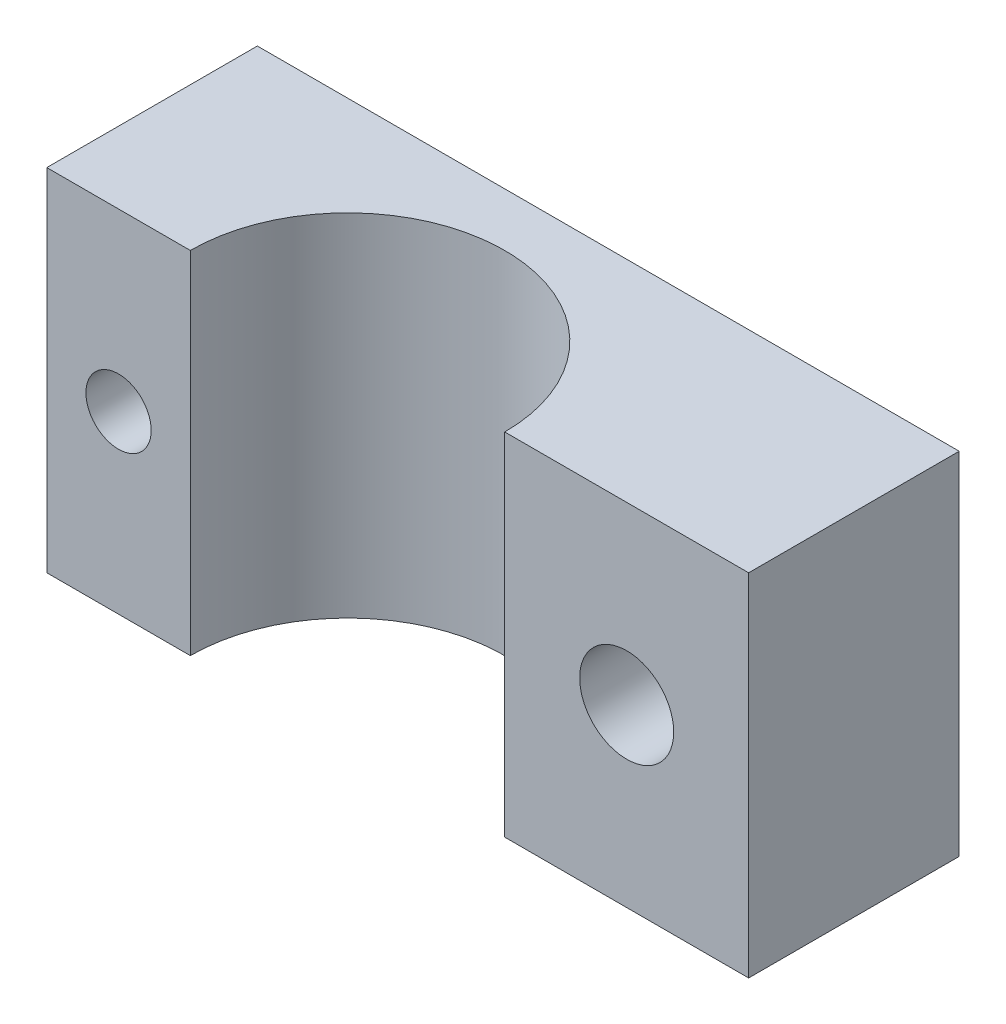
ISO-10303-21;
HEADER;
FILE_DESCRIPTION(('STEP AP214'),'2;1');
FILE_NAME('part.step','',(''),(''),'','','');
FILE_SCHEMA(('AUTOMOTIVE_DESIGN { 1 0 10303 214 1 1 1 1 }'));
ENDSEC;
DATA;
#1=APPLICATION_CONTEXT('core data for automotive mechanical design processes');
#2=APPLICATION_PROTOCOL_DEFINITION('international standard','automotive_design',2000,#1);
#3=PRODUCT_CONTEXT('',#1,'mechanical');
#4=PRODUCT('Part','Part','',(#3));
#5=PRODUCT_RELATED_PRODUCT_CATEGORY('part','',(#4));
#6=PRODUCT_DEFINITION_FORMATION('','',#4);
#7=PRODUCT_DEFINITION_CONTEXT('part definition',#1,'design');
#8=PRODUCT_DEFINITION('design','',#6,#7);
#9=PRODUCT_DEFINITION_SHAPE('','',#8);
#10=(LENGTH_UNIT() NAMED_UNIT(*) SI_UNIT(.MILLI.,.METRE.));
#11=(NAMED_UNIT(*) PLANE_ANGLE_UNIT() SI_UNIT($,.RADIAN.));
#12=(NAMED_UNIT(*) SI_UNIT($,.STERADIAN.) SOLID_ANGLE_UNIT());
#13=UNCERTAINTY_MEASURE_WITH_UNIT(LENGTH_MEASURE(1.E-05),#10,'distance_accuracy_value','');
#14=(GEOMETRIC_REPRESENTATION_CONTEXT(3) GLOBAL_UNCERTAINTY_ASSIGNED_CONTEXT((#13)) GLOBAL_UNIT_ASSIGNED_CONTEXT((#10,
#11,#12)) REPRESENTATION_CONTEXT('',''));
#15=CARTESIAN_POINT('',(0.,0.,0.));
#16=DIRECTION('',(0.,0.,1.));
#17=DIRECTION('',(1.,0.,0.));
#18=AXIS2_PLACEMENT_3D('',#15,#16,#17);
#19=CARTESIAN_POINT('',(0.,25.,0.));
#20=DIRECTION('',(0.,0.,-1.));
#21=DIRECTION('',(-1.,0.,0.));
#22=AXIS2_PLACEMENT_3D('',#19,#20,#21);
#23=PLANE('',#22);
#24=CARTESIAN_POINT('',(41.31173,12.5,0.));
#25=DIRECTION('',(0.,0.,1.));
#26=DIRECTION('',(1.,0.,0.));
#27=AXIS2_PLACEMENT_3D('',#24,#25,#26);
#28=CIRCLE('',#27,3.35);
#29=CARTESIAN_POINT('',(44.66173,12.5,0.));
#30=VERTEX_POINT('',#29);
#31=EDGE_CURVE('E168',#30,#30,#28,.T.);
#32=ORIENTED_EDGE('',*,*,#31,.F.);
#33=EDGE_LOOP('',(#32));
#34=FACE_BOUND('',#33,.T.);
#35=DIRECTION('',(0.,-1.,0.));
#36=VECTOR('',#35,1.);
#37=CARTESIAN_POINT('',(32.62346,25.,0.));
#38=LINE('',#37,#36);
#39=CARTESIAN_POINT('',(32.62346,0.,0.));
#40=VERTEX_POINT('',#39);
#41=CARTESIAN_POINT('',(32.62346,25.,0.));
#42=VERTEX_POINT('',#41);
#43=EDGE_CURVE('E99',#40,#42,#38,.F.);
#44=ORIENTED_EDGE('',*,*,#43,.F.);
#45=DIRECTION('',(1.,0.,0.));
#46=VECTOR('',#45,1.);
#47=CARTESIAN_POINT('',(0.,0.,0.));
#48=LINE('',#47,#46);
#49=CARTESIAN_POINT('',(50.,0.,0.));
#50=VERTEX_POINT('',#49);
#51=EDGE_CURVE('E125',#40,#50,#48,.T.);
#52=ORIENTED_EDGE('',*,*,#51,.T.);
#53=DIRECTION('',(0.,-1.,0.));
#54=VECTOR('',#53,1.);
#55=CARTESIAN_POINT('',(50.,25.,0.));
#56=LINE('',#55,#54);
#57=CARTESIAN_POINT('',(50.,25.,0.));
#58=VERTEX_POINT('',#57);
#59=EDGE_CURVE('E47',#58,#50,#56,.T.);
#60=ORIENTED_EDGE('',*,*,#59,.F.);
#61=DIRECTION('',(1.,0.,0.));
#62=VECTOR('',#61,1.);
#63=CARTESIAN_POINT('',(0.,25.,0.));
#64=LINE('',#63,#62);
#65=EDGE_CURVE('E110',#42,#58,#64,.T.);
#66=ORIENTED_EDGE('',*,*,#65,.F.);
#67=EDGE_LOOP('',(#44,#52,#60,#66));
#68=FACE_BOUND('',#67,.T.);
#69=ADVANCED_FACE('F39',(#34,#68),#23,.F.);
#70=CARTESIAN_POINT('',(5.11173,12.5,0.));
#71=DIRECTION('',(0.,0.,1.));
#72=DIRECTION('',(1.,0.,0.));
#73=AXIS2_PLACEMENT_3D('',#70,#71,#72);
#74=CIRCLE('',#73,2.325);
#75=CARTESIAN_POINT('',(7.43673,12.5,0.));
#76=VERTEX_POINT('',#75);
#77=EDGE_CURVE('E170',#76,#76,#74,.T.);
#78=ORIENTED_EDGE('',*,*,#77,.F.);
#79=EDGE_LOOP('',(#78));
#80=FACE_BOUND('',#79,.T.);
#81=DIRECTION('',(0.,-1.,0.));
#82=VECTOR('',#81,1.);
#83=CARTESIAN_POINT('',(10.22346,25.,0.));
#84=LINE('',#83,#82);
#85=CARTESIAN_POINT('',(10.22346,25.,0.));
#86=VERTEX_POINT('',#85);
#87=CARTESIAN_POINT('',(10.22346,0.,0.));
#88=VERTEX_POINT('',#87);
#89=EDGE_CURVE('E54',#86,#88,#84,.T.);
#90=ORIENTED_EDGE('',*,*,#89,.F.);
#91=CARTESIAN_POINT('',(0.,25.,0.));
#92=VERTEX_POINT('',#91);
#93=EDGE_CURVE('E90',#92,#86,#64,.T.);
#94=ORIENTED_EDGE('',*,*,#93,.F.);
#95=DIRECTION('',(0.,-1.,0.));
#96=VECTOR('',#95,1.);
#97=CARTESIAN_POINT('',(0.,25.,0.));
#98=LINE('',#97,#96);
#99=CARTESIAN_POINT('',(0.,0.,0.));
#100=VERTEX_POINT('',#99);
#101=EDGE_CURVE('E11',#92,#100,#98,.T.);
#102=ORIENTED_EDGE('',*,*,#101,.T.);
#103=EDGE_CURVE('E126',#100,#88,#48,.T.);
#104=ORIENTED_EDGE('',*,*,#103,.T.);
#105=EDGE_LOOP('',(#90,#94,#102,#104));
#106=FACE_BOUND('',#105,.T.);
#107=ADVANCED_FACE('F160',(#80,#106),#23,.F.);
#108=CARTESIAN_POINT('',(0.,25.,0.));
#109=DIRECTION('',(1.,0.,0.));
#110=DIRECTION('',(0.,0.,-1.));
#111=AXIS2_PLACEMENT_3D('',#108,#109,#110);
#112=PLANE('',#111);
#113=DIRECTION('',(0.,0.,1.));
#114=VECTOR('',#113,1.);
#115=CARTESIAN_POINT('',(0.,0.,0.));
#116=LINE('',#115,#114);
#117=CARTESIAN_POINT('',(0.,0.,-15.));
#118=VERTEX_POINT('',#117);
#119=EDGE_CURVE('E107',#118,#100,#116,.T.);
#120=ORIENTED_EDGE('',*,*,#119,.T.);
#121=ORIENTED_EDGE('',*,*,#101,.F.);
#122=DIRECTION('',(0.,0.,1.));
#123=VECTOR('',#122,1.);
#124=CARTESIAN_POINT('',(0.,25.,0.));
#125=LINE('',#124,#123);
#126=CARTESIAN_POINT('',(0.,25.,-15.));
#127=VERTEX_POINT('',#126);
#128=EDGE_CURVE('E115',#127,#92,#125,.T.);
#129=ORIENTED_EDGE('',*,*,#128,.F.);
#130=DIRECTION('',(0.,-1.,0.));
#131=VECTOR('',#130,1.);
#132=CARTESIAN_POINT('',(0.,25.,-15.));
#133=LINE('',#132,#131);
#134=EDGE_CURVE('E122',#127,#118,#133,.T.);
#135=ORIENTED_EDGE('',*,*,#134,.T.);
#136=EDGE_LOOP('',(#120,#121,#129,#135));
#137=FACE_BOUND('',#136,.T.);
#138=ADVANCED_FACE('F41',(#137),#112,.F.);
#139=CARTESIAN_POINT('',(50.,25.,0.));
#140=DIRECTION('',(-1.,0.,0.));
#141=DIRECTION('',(0.,0.,1.));
#142=AXIS2_PLACEMENT_3D('',#139,#140,#141);
#143=PLANE('',#142);
#144=DIRECTION('',(0.,0.,-1.));
#145=VECTOR('',#144,1.);
#146=CARTESIAN_POINT('',(50.,0.,0.));
#147=LINE('',#146,#145);
#148=CARTESIAN_POINT('',(50.,0.,-15.));
#149=VERTEX_POINT('',#148);
#150=EDGE_CURVE('E129',#50,#149,#147,.T.);
#151=ORIENTED_EDGE('',*,*,#150,.T.);
#152=DIRECTION('',(0.,-1.,0.));
#153=VECTOR('',#152,1.);
#154=CARTESIAN_POINT('',(50.,25.,-15.));
#155=LINE('',#154,#153);
#156=CARTESIAN_POINT('',(50.,25.,-15.));
#157=VERTEX_POINT('',#156);
#158=EDGE_CURVE('E133',#157,#149,#155,.T.);
#159=ORIENTED_EDGE('',*,*,#158,.F.);
#160=DIRECTION('',(0.,0.,-1.));
#161=VECTOR('',#160,1.);
#162=CARTESIAN_POINT('',(50.,25.,0.));
#163=LINE('',#162,#161);
#164=EDGE_CURVE('E117',#58,#157,#163,.T.);
#165=ORIENTED_EDGE('',*,*,#164,.F.);
#166=ORIENTED_EDGE('',*,*,#59,.T.);
#167=EDGE_LOOP('',(#151,#159,#165,#166));
#168=FACE_BOUND('',#167,.T.);
#169=ADVANCED_FACE('F136',(#168),#143,.F.);
#170=CARTESIAN_POINT('',(0.,25.,-15.));
#171=DIRECTION('',(0.,0.,1.));
#172=DIRECTION('',(1.,0.,0.));
#173=AXIS2_PLACEMENT_3D('',#170,#171,#172);
#174=PLANE('',#173);
#175=CARTESIAN_POINT('',(5.11173,12.5,-15.));
#176=DIRECTION('',(0.,0.,1.));
#177=DIRECTION('',(1.,0.,0.));
#178=AXIS2_PLACEMENT_3D('',#175,#176,#177);
#179=CIRCLE('',#178,2.325);
#180=CARTESIAN_POINT('',(7.43673,12.5,-15.));
#181=VERTEX_POINT('',#180);
#182=EDGE_CURVE('E174',#181,#181,#179,.T.);
#183=ORIENTED_EDGE('',*,*,#182,.T.);
#184=EDGE_LOOP('',(#183));
#185=FACE_BOUND('',#184,.T.);
#186=CARTESIAN_POINT('',(41.31173,12.5,-15.));
#187=DIRECTION('',(0.,0.,1.));
#188=DIRECTION('',(1.,0.,0.));
#189=AXIS2_PLACEMENT_3D('',#186,#187,#188);
#190=CIRCLE('',#189,3.35);
#191=CARTESIAN_POINT('',(44.66173,12.5,-15.));
#192=VERTEX_POINT('',#191);
#193=EDGE_CURVE('E171',#192,#192,#190,.T.);
#194=ORIENTED_EDGE('',*,*,#193,.T.);
#195=EDGE_LOOP('',(#194));
#196=FACE_BOUND('',#195,.T.);
#197=DIRECTION('',(-1.,0.,0.));
#198=VECTOR('',#197,1.);
#199=CARTESIAN_POINT('',(0.,0.,-15.));
#200=LINE('',#199,#198);
#201=EDGE_CURVE('E84',#149,#118,#200,.T.);
#202=ORIENTED_EDGE('',*,*,#201,.T.);
#203=ORIENTED_EDGE('',*,*,#134,.F.);
#204=DIRECTION('',(-1.,0.,0.));
#205=VECTOR('',#204,1.);
#206=CARTESIAN_POINT('',(0.,25.,-15.));
#207=LINE('',#206,#205);
#208=EDGE_CURVE('E63',#157,#127,#207,.T.);
#209=ORIENTED_EDGE('',*,*,#208,.F.);
#210=ORIENTED_EDGE('',*,*,#158,.T.);
#211=EDGE_LOOP('',(#202,#203,#209,#210));
#212=FACE_BOUND('',#211,.T.);
#213=ADVANCED_FACE('F144',(#185,#196,#212),#174,.F.);
#214=CARTESIAN_POINT('',(0.,25.,0.));
#215=DIRECTION('',(0.,-1.,0.));
#216=DIRECTION('',(0.,0.,-1.));
#217=AXIS2_PLACEMENT_3D('',#214,#215,#216);
#218=PLANE('',#217);
#219=CARTESIAN_POINT('',(21.42346,25.,0.));
#220=DIRECTION('',(0.,1.,0.));
#221=DIRECTION('',(0.,0.,1.));
#222=AXIS2_PLACEMENT_3D('',#219,#220,#221);
#223=CIRCLE('',#222,11.2);
#224=EDGE_CURVE('E102',#42,#86,#223,.T.);
#225=ORIENTED_EDGE('',*,*,#224,.F.);
#226=ORIENTED_EDGE('',*,*,#65,.T.);
#227=ORIENTED_EDGE('',*,*,#164,.T.);
#228=ORIENTED_EDGE('',*,*,#208,.T.);
#229=ORIENTED_EDGE('',*,*,#128,.T.);
#230=ORIENTED_EDGE('',*,*,#93,.T.);
#231=EDGE_LOOP('',(#225,#226,#227,#228,#229,#230));
#232=FACE_BOUND('',#231,.T.);
#233=ADVANCED_FACE('F109',(#232),#218,.F.);
#234=CARTESIAN_POINT('',(0.,0.,0.));
#235=DIRECTION('',(0.,-1.,0.));
#236=DIRECTION('',(0.,0.,-1.));
#237=AXIS2_PLACEMENT_3D('',#234,#235,#236);
#238=PLANE('',#237);
#239=ORIENTED_EDGE('',*,*,#51,.F.);
#240=CARTESIAN_POINT('',(21.42346,0.,0.));
#241=DIRECTION('',(0.,1.,0.));
#242=DIRECTION('',(0.,0.,1.));
#243=AXIS2_PLACEMENT_3D('',#240,#241,#242);
#244=CIRCLE('',#243,11.2);
#245=EDGE_CURVE('E103',#40,#88,#244,.T.);
#246=ORIENTED_EDGE('',*,*,#245,.T.);
#247=ORIENTED_EDGE('',*,*,#103,.F.);
#248=ORIENTED_EDGE('',*,*,#119,.F.);
#249=ORIENTED_EDGE('',*,*,#201,.F.);
#250=ORIENTED_EDGE('',*,*,#150,.F.);
#251=EDGE_LOOP('',(#239,#246,#247,#248,#249,#250));
#252=FACE_BOUND('',#251,.T.);
#253=ADVANCED_FACE('F139',(#252),#238,.T.);
#254=CARTESIAN_POINT('',(21.42346,25.,0.));
#255=DIRECTION('',(0.,-1.,0.));
#256=DIRECTION('',(0.,0.,-1.));
#257=AXIS2_PLACEMENT_3D('',#254,#255,#256);
#258=CYLINDRICAL_SURFACE('',#257,11.2);
#259=ORIENTED_EDGE('',*,*,#43,.T.);
#260=ORIENTED_EDGE('',*,*,#224,.T.);
#261=ORIENTED_EDGE('',*,*,#89,.T.);
#262=ORIENTED_EDGE('',*,*,#245,.F.);
#263=EDGE_LOOP('',(#259,#260,#261,#262));
#264=FACE_BOUND('',#263,.T.);
#265=ADVANCED_FACE('F101',(#264),#258,.F.);
#266=CARTESIAN_POINT('',(41.31173,12.5,-15.));
#267=DIRECTION('',(0.,0.,1.));
#268=DIRECTION('',(1.,0.,0.));
#269=AXIS2_PLACEMENT_3D('',#266,#267,#268);
#270=CYLINDRICAL_SURFACE('',#269,3.35);
#271=ORIENTED_EDGE('',*,*,#193,.F.);
#272=EDGE_LOOP('',(#271));
#273=FACE_BOUND('',#272,.T.);
#274=ORIENTED_EDGE('',*,*,#31,.T.);
#275=EDGE_LOOP('',(#274));
#276=FACE_BOUND('',#275,.T.);
#277=ADVANCED_FACE('F186',(#273,#276),#270,.F.);
#278=CARTESIAN_POINT('',(5.11173,12.5,-15.));
#279=DIRECTION('',(0.,0.,1.));
#280=DIRECTION('',(1.,0.,0.));
#281=AXIS2_PLACEMENT_3D('',#278,#279,#280);
#282=CYLINDRICAL_SURFACE('',#281,2.325);
#283=ORIENTED_EDGE('',*,*,#182,.F.);
#284=EDGE_LOOP('',(#283));
#285=FACE_BOUND('',#284,.T.);
#286=ORIENTED_EDGE('',*,*,#77,.T.);
#287=EDGE_LOOP('',(#286));
#288=FACE_BOUND('',#287,.T.);
#289=ADVANCED_FACE('F183',(#285,#288),#282,.F.);
#290=CLOSED_SHELL('',(#69,#107,#138,#169,#213,#233,#253,#265,#277,#289));
#291=MANIFOLD_SOLID_BREP('B2',#290);
#292=ADVANCED_BREP_SHAPE_REPRESENTATION('',(#18,#291),#14);
#293=SHAPE_DEFINITION_REPRESENTATION(#9,#292);
ENDSEC;
END-ISO-10303-21;
